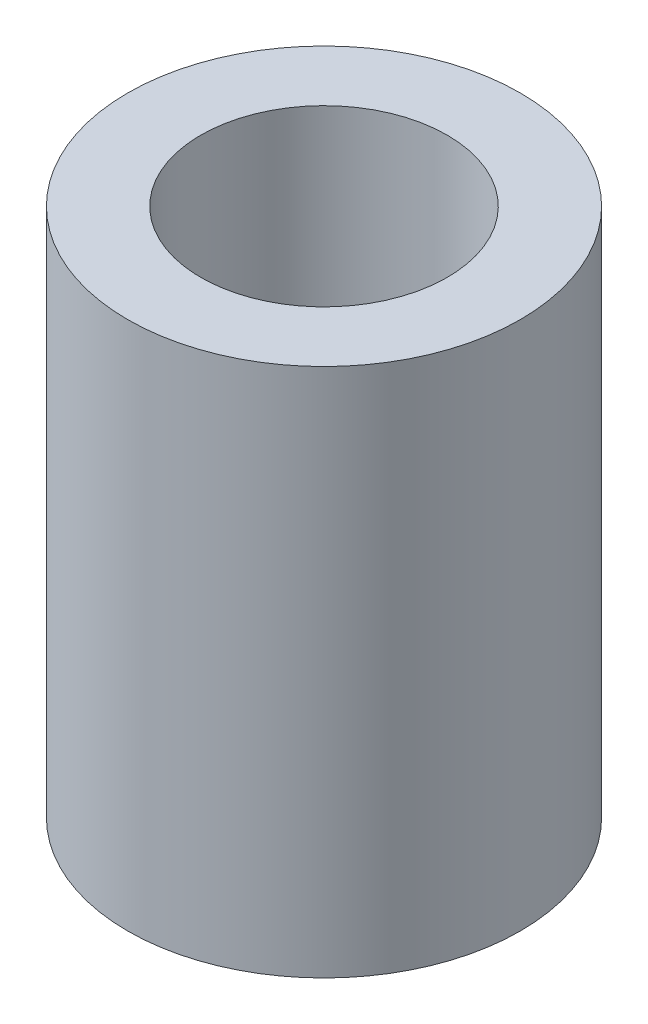
ISO-10303-21;
HEADER;
FILE_DESCRIPTION(('STEP AP214'),'2;1');
FILE_NAME('part.step','',(''),(''),'','','');
FILE_SCHEMA(('AUTOMOTIVE_DESIGN { 1 0 10303 214 1 1 1 1 }'));
ENDSEC;
DATA;
#1=APPLICATION_CONTEXT('core data for automotive mechanical design processes');
#2=APPLICATION_PROTOCOL_DEFINITION('international standard','automotive_design',2000,#1);
#3=PRODUCT_CONTEXT('',#1,'mechanical');
#4=PRODUCT('Part','Part','',(#3));
#5=PRODUCT_RELATED_PRODUCT_CATEGORY('part','',(#4));
#6=PRODUCT_DEFINITION_FORMATION('','',#4);
#7=PRODUCT_DEFINITION_CONTEXT('part definition',#1,'design');
#8=PRODUCT_DEFINITION('design','',#6,#7);
#9=PRODUCT_DEFINITION_SHAPE('','',#8);
#10=(LENGTH_UNIT() NAMED_UNIT(*) SI_UNIT(.MILLI.,.METRE.));
#11=(NAMED_UNIT(*) PLANE_ANGLE_UNIT() SI_UNIT($,.RADIAN.));
#12=(NAMED_UNIT(*) SI_UNIT($,.STERADIAN.) SOLID_ANGLE_UNIT());
#13=UNCERTAINTY_MEASURE_WITH_UNIT(LENGTH_MEASURE(1.E-05),#10,'distance_accuracy_value','');
#14=(GEOMETRIC_REPRESENTATION_CONTEXT(3) GLOBAL_UNCERTAINTY_ASSIGNED_CONTEXT((#13)) GLOBAL_UNIT_ASSIGNED_CONTEXT((#10,
#11,#12)) REPRESENTATION_CONTEXT('',''));
#15=CARTESIAN_POINT('',(0.,0.,0.));
#16=DIRECTION('',(0.,0.,1.));
#17=DIRECTION('',(1.,0.,0.));
#18=AXIS2_PLACEMENT_3D('',#15,#16,#17);
#19=CARTESIAN_POINT('',(0.,14.5,0.));
#20=DIRECTION('',(0.,1.,0.));
#21=DIRECTION('',(0.,0.,1.));
#22=AXIS2_PLACEMENT_3D('',#19,#20,#21);
#23=PLANE('',#22);
#24=CARTESIAN_POINT('',(0.,14.5,0.));
#25=DIRECTION('',(0.,1.,0.));
#26=DIRECTION('',(0.,0.,1.));
#27=AXIS2_PLACEMENT_3D('',#24,#25,#26);
#28=CIRCLE('',#27,5.375);
#29=CARTESIAN_POINT('',(0.,14.5,-5.375));
#30=VERTEX_POINT('',#29);
#31=EDGE_CURVE('E10',#30,#30,#28,.T.);
#32=ORIENTED_EDGE('',*,*,#31,.T.);
#33=EDGE_LOOP('',(#32));
#34=FACE_BOUND('',#33,.T.);
#35=CARTESIAN_POINT('',(0.,14.5,0.));
#36=DIRECTION('',(0.,1.,0.));
#37=DIRECTION('',(0.,0.,1.));
#38=AXIS2_PLACEMENT_3D('',#35,#36,#37);
#39=CIRCLE('',#38,3.375);
#40=CARTESIAN_POINT('',(0.,14.5,-3.375));
#41=VERTEX_POINT('',#40);
#42=EDGE_CURVE('E42',#41,#41,#39,.T.);
#43=ORIENTED_EDGE('',*,*,#42,.F.);
#44=EDGE_LOOP('',(#43));
#45=FACE_BOUND('',#44,.T.);
#46=ADVANCED_FACE('F31',(#34,#45),#23,.T.);
#47=CARTESIAN_POINT('',(0.,0.,0.));
#48=DIRECTION('',(0.,1.,0.));
#49=DIRECTION('',(0.,0.,1.));
#50=AXIS2_PLACEMENT_3D('',#47,#48,#49);
#51=PLANE('',#50);
#52=CARTESIAN_POINT('',(0.,0.,0.));
#53=DIRECTION('',(0.,1.,0.));
#54=DIRECTION('',(0.,0.,1.));
#55=AXIS2_PLACEMENT_3D('',#52,#53,#54);
#56=CIRCLE('',#55,5.375);
#57=CARTESIAN_POINT('',(0.,0.,-5.375));
#58=VERTEX_POINT('',#57);
#59=EDGE_CURVE('E35',#58,#58,#56,.T.);
#60=ORIENTED_EDGE('',*,*,#59,.F.);
#61=EDGE_LOOP('',(#60));
#62=FACE_BOUND('',#61,.T.);
#63=CARTESIAN_POINT('',(0.,0.,0.));
#64=DIRECTION('',(0.,1.,0.));
#65=DIRECTION('',(0.,0.,1.));
#66=AXIS2_PLACEMENT_3D('',#63,#64,#65);
#67=CIRCLE('',#66,3.375);
#68=CARTESIAN_POINT('',(0.,0.,-3.375));
#69=VERTEX_POINT('',#68);
#70=EDGE_CURVE('E44',#69,#69,#67,.T.);
#71=ORIENTED_EDGE('',*,*,#70,.T.);
#72=EDGE_LOOP('',(#71));
#73=FACE_BOUND('',#72,.T.);
#74=ADVANCED_FACE('F54',(#62,#73),#51,.F.);
#75=CARTESIAN_POINT('',(0.,14.5,0.));
#76=DIRECTION('',(0.,-1.,0.));
#77=DIRECTION('',(0.,0.,-1.));
#78=AXIS2_PLACEMENT_3D('',#75,#76,#77);
#79=CYLINDRICAL_SURFACE('',#78,5.375);
#80=CARTESIAN_POINT('',(0.,14.5,-5.375));
#81=CARTESIAN_POINT('',(0.,14.3489583333333,-5.375));
#82=CARTESIAN_POINT('',(0.,14.1979166666667,-5.375));
#83=CARTESIAN_POINT('',(0.,13.8958333333333,-5.375));
#84=CARTESIAN_POINT('',(0.,13.7447916666667,-5.375));
#85=CARTESIAN_POINT('',(0.,13.4427083333333,-5.375));
#86=CARTESIAN_POINT('',(0.,13.2916666666667,-5.375));
#87=CARTESIAN_POINT('',(0.,12.9895833333333,-5.375));
#88=CARTESIAN_POINT('',(0.,12.8385416666667,-5.375));
#89=CARTESIAN_POINT('',(0.,12.5364583333333,-5.375));
#90=CARTESIAN_POINT('',(0.,12.3854166666667,-5.375));
#91=CARTESIAN_POINT('',(0.,12.0833333333333,-5.375));
#92=CARTESIAN_POINT('',(0.,11.9322916666667,-5.375));
#93=CARTESIAN_POINT('',(0.,11.6302083333333,-5.375));
#94=CARTESIAN_POINT('',(0.,11.4791666666667,-5.375));
#95=CARTESIAN_POINT('',(0.,11.1770833333333,-5.375));
#96=CARTESIAN_POINT('',(0.,11.0260416666667,-5.375));
#97=CARTESIAN_POINT('',(0.,10.7239583333333,-5.375));
#98=CARTESIAN_POINT('',(0.,10.5729166666667,-5.375));
#99=CARTESIAN_POINT('',(0.,10.2708333333333,-5.375));
#100=CARTESIAN_POINT('',(0.,10.1197916666667,-5.375));
#101=CARTESIAN_POINT('',(0.,9.81770833333333,-5.375));
#102=CARTESIAN_POINT('',(0.,9.66666666666667,-5.375));
#103=CARTESIAN_POINT('',(0.,9.36458333333333,-5.375));
#104=CARTESIAN_POINT('',(0.,9.21354166666667,-5.375));
#105=CARTESIAN_POINT('',(0.,8.91145833333333,-5.375));
#106=CARTESIAN_POINT('',(0.,8.76041666666667,-5.375));
#107=CARTESIAN_POINT('',(0.,8.45833333333333,-5.375));
#108=CARTESIAN_POINT('',(0.,8.30729166666667,-5.375));
#109=CARTESIAN_POINT('',(0.,8.00520833333333,-5.375));
#110=CARTESIAN_POINT('',(0.,7.85416666666667,-5.375));
#111=CARTESIAN_POINT('',(0.,7.55208333333333,-5.375));
#112=CARTESIAN_POINT('',(0.,7.40104166666667,-5.375));
#113=CARTESIAN_POINT('',(0.,7.09895833333333,-5.375));
#114=CARTESIAN_POINT('',(0.,6.94791666666667,-5.375));
#115=CARTESIAN_POINT('',(0.,6.64583333333333,-5.375));
#116=CARTESIAN_POINT('',(0.,6.49479166666667,-5.375));
#117=CARTESIAN_POINT('',(0.,6.19270833333333,-5.375));
#118=CARTESIAN_POINT('',(0.,6.04166666666667,-5.375));
#119=CARTESIAN_POINT('',(0.,5.73958333333333,-5.375));
#120=CARTESIAN_POINT('',(0.,5.58854166666667,-5.375));
#121=CARTESIAN_POINT('',(0.,5.28645833333333,-5.375));
#122=CARTESIAN_POINT('',(0.,5.13541666666667,-5.375));
#123=CARTESIAN_POINT('',(0.,4.83333333333333,-5.375));
#124=CARTESIAN_POINT('',(0.,4.68229166666667,-5.375));
#125=CARTESIAN_POINT('',(0.,4.38020833333333,-5.375));
#126=CARTESIAN_POINT('',(0.,4.22916666666667,-5.375));
#127=CARTESIAN_POINT('',(0.,3.92708333333333,-5.375));
#128=CARTESIAN_POINT('',(0.,3.77604166666667,-5.375));
#129=CARTESIAN_POINT('',(0.,3.47395833333333,-5.375));
#130=CARTESIAN_POINT('',(0.,3.32291666666667,-5.375));
#131=CARTESIAN_POINT('',(0.,3.02083333333333,-5.375));
#132=CARTESIAN_POINT('',(0.,2.86979166666667,-5.375));
#133=CARTESIAN_POINT('',(0.,2.56770833333333,-5.375));
#134=CARTESIAN_POINT('',(0.,2.41666666666667,-5.375));
#135=CARTESIAN_POINT('',(0.,2.11458333333333,-5.375));
#136=CARTESIAN_POINT('',(0.,1.96354166666667,-5.375));
#137=CARTESIAN_POINT('',(0.,1.66145833333333,-5.375));
#138=CARTESIAN_POINT('',(0.,1.51041666666667,-5.375));
#139=CARTESIAN_POINT('',(0.,1.20833333333333,-5.375));
#140=CARTESIAN_POINT('',(0.,1.05729166666667,-5.375));
#141=CARTESIAN_POINT('',(0.,0.755208333333334,-5.375));
#142=CARTESIAN_POINT('',(0.,0.604166666666667,-5.375));
#143=CARTESIAN_POINT('',(0.,0.302083333333333,-5.375));
#144=CARTESIAN_POINT('',(0.,0.151041666666667,-5.375));
#145=CARTESIAN_POINT('',(0.,0.,-5.375));
#146=B_SPLINE_CURVE_WITH_KNOTS('',3,(#80,#81,#82,#83,#84,#85,#86,#87,#88,#89,#90,#91,#92,#93,
#94,#95,#96,#97,#98,#99,#100,#101,#102,#103,#104,#105,#106,#107,#108,#109,#110,#111,#112,#113,
#114,#115,#116,#117,#118,#119,#120,#121,#122,#123,#124,#125,#126,#127,#128,#129,#130,#131,#132,
#133,#134,#135,#136,#137,#138,#139,#140,#141,#142,#143,#144,#145),.UNSPECIFIED.,.F.,.F.,(4,2,2,
2,2,2,2,2,2,2,2,2,2,2,2,2,2,2,2,2,2,2,2,2,2,2,2,2,2,2,2,2,4),(0.,0.453124999999999,
0.906249999999999,1.359375,1.8125,2.265625,2.71875,3.171875,3.625,4.078125,4.53125,4.984375,
5.4375,5.890625,6.34375,6.796875,7.25,7.703125,8.15625,8.609375,9.0625,9.515625,9.96875,
10.421875,10.875,11.328125,11.78125,12.234375,12.6875,13.140625,13.59375,14.046875,14.5),.UNSPECIFIED.);
#147=EDGE_CURVE('BSEAM33',#30,#58,#146,.T.);
#148=ORIENTED_EDGE('',*,*,#31,.F.);
#149=ORIENTED_EDGE('',*,*,#59,.T.);
#150=ORIENTED_EDGE('',*,*,#147,.T.);
#151=ORIENTED_EDGE('',*,*,#147,.F.);
#152=EDGE_LOOP('',(#148,#150,#149,#151));
#153=FACE_BOUND('',#152,.T.);
#154=ADVANCED_FACE('F33',(#153),#79,.T.);
#155=CARTESIAN_POINT('',(0.,14.5,0.));
#156=DIRECTION('',(0.,-1.,0.));
#157=DIRECTION('',(0.,0.,-1.));
#158=AXIS2_PLACEMENT_3D('',#155,#156,#157);
#159=CYLINDRICAL_SURFACE('',#158,3.375);
#160=CARTESIAN_POINT('',(0.,14.5,-3.375));
#161=CARTESIAN_POINT('',(0.,14.3489583333333,-3.375));
#162=CARTESIAN_POINT('',(0.,14.1979166666667,-3.375));
#163=CARTESIAN_POINT('',(0.,13.8958333333333,-3.375));
#164=CARTESIAN_POINT('',(0.,13.7447916666667,-3.375));
#165=CARTESIAN_POINT('',(0.,13.4427083333333,-3.375));
#166=CARTESIAN_POINT('',(0.,13.2916666666667,-3.375));
#167=CARTESIAN_POINT('',(0.,12.9895833333333,-3.375));
#168=CARTESIAN_POINT('',(0.,12.8385416666667,-3.375));
#169=CARTESIAN_POINT('',(0.,12.5364583333333,-3.375));
#170=CARTESIAN_POINT('',(0.,12.3854166666667,-3.375));
#171=CARTESIAN_POINT('',(0.,12.0833333333333,-3.375));
#172=CARTESIAN_POINT('',(0.,11.9322916666667,-3.375));
#173=CARTESIAN_POINT('',(0.,11.6302083333333,-3.375));
#174=CARTESIAN_POINT('',(0.,11.4791666666667,-3.375));
#175=CARTESIAN_POINT('',(0.,11.1770833333333,-3.375));
#176=CARTESIAN_POINT('',(0.,11.0260416666667,-3.375));
#177=CARTESIAN_POINT('',(0.,10.7239583333333,-3.375));
#178=CARTESIAN_POINT('',(0.,10.5729166666667,-3.375));
#179=CARTESIAN_POINT('',(0.,10.2708333333333,-3.375));
#180=CARTESIAN_POINT('',(0.,10.1197916666667,-3.375));
#181=CARTESIAN_POINT('',(0.,9.81770833333333,-3.375));
#182=CARTESIAN_POINT('',(0.,9.66666666666667,-3.375));
#183=CARTESIAN_POINT('',(0.,9.36458333333333,-3.375));
#184=CARTESIAN_POINT('',(0.,9.21354166666667,-3.375));
#185=CARTESIAN_POINT('',(0.,8.91145833333333,-3.375));
#186=CARTESIAN_POINT('',(0.,8.76041666666667,-3.375));
#187=CARTESIAN_POINT('',(0.,8.45833333333333,-3.375));
#188=CARTESIAN_POINT('',(0.,8.30729166666667,-3.375));
#189=CARTESIAN_POINT('',(0.,8.00520833333333,-3.375));
#190=CARTESIAN_POINT('',(0.,7.85416666666667,-3.375));
#191=CARTESIAN_POINT('',(0.,7.55208333333333,-3.375));
#192=CARTESIAN_POINT('',(0.,7.40104166666667,-3.375));
#193=CARTESIAN_POINT('',(0.,7.09895833333333,-3.375));
#194=CARTESIAN_POINT('',(0.,6.94791666666667,-3.375));
#195=CARTESIAN_POINT('',(0.,6.64583333333333,-3.375));
#196=CARTESIAN_POINT('',(0.,6.49479166666667,-3.375));
#197=CARTESIAN_POINT('',(0.,6.19270833333333,-3.375));
#198=CARTESIAN_POINT('',(0.,6.04166666666667,-3.375));
#199=CARTESIAN_POINT('',(0.,5.73958333333333,-3.375));
#200=CARTESIAN_POINT('',(0.,5.58854166666667,-3.375));
#201=CARTESIAN_POINT('',(0.,5.28645833333333,-3.375));
#202=CARTESIAN_POINT('',(0.,5.13541666666667,-3.375));
#203=CARTESIAN_POINT('',(0.,4.83333333333333,-3.375));
#204=CARTESIAN_POINT('',(0.,4.68229166666667,-3.375));
#205=CARTESIAN_POINT('',(0.,4.38020833333333,-3.375));
#206=CARTESIAN_POINT('',(0.,4.22916666666667,-3.375));
#207=CARTESIAN_POINT('',(0.,3.92708333333333,-3.375));
#208=CARTESIAN_POINT('',(0.,3.77604166666667,-3.375));
#209=CARTESIAN_POINT('',(0.,3.47395833333333,-3.375));
#210=CARTESIAN_POINT('',(0.,3.32291666666667,-3.375));
#211=CARTESIAN_POINT('',(0.,3.02083333333333,-3.375));
#212=CARTESIAN_POINT('',(0.,2.86979166666667,-3.375));
#213=CARTESIAN_POINT('',(0.,2.56770833333333,-3.375));
#214=CARTESIAN_POINT('',(0.,2.41666666666667,-3.375));
#215=CARTESIAN_POINT('',(0.,2.11458333333333,-3.375));
#216=CARTESIAN_POINT('',(0.,1.96354166666667,-3.375));
#217=CARTESIAN_POINT('',(0.,1.66145833333333,-3.375));
#218=CARTESIAN_POINT('',(0.,1.51041666666667,-3.375));
#219=CARTESIAN_POINT('',(0.,1.20833333333333,-3.375));
#220=CARTESIAN_POINT('',(0.,1.05729166666667,-3.375));
#221=CARTESIAN_POINT('',(0.,0.755208333333334,-3.375));
#222=CARTESIAN_POINT('',(0.,0.604166666666667,-3.375));
#223=CARTESIAN_POINT('',(0.,0.302083333333333,-3.375));
#224=CARTESIAN_POINT('',(0.,0.151041666666667,-3.375));
#225=CARTESIAN_POINT('',(0.,0.,-3.375));
#226=B_SPLINE_CURVE_WITH_KNOTS('',3,(#160,#161,#162,#163,#164,#165,#166,#167,#168,#169,#170,
#171,#172,#173,#174,#175,#176,#177,#178,#179,#180,#181,#182,#183,#184,#185,#186,#187,#188,#189,
#190,#191,#192,#193,#194,#195,#196,#197,#198,#199,#200,#201,#202,#203,#204,#205,#206,#207,#208,
#209,#210,#211,#212,#213,#214,#215,#216,#217,#218,#219,#220,#221,#222,#223,#224,#225),
.UNSPECIFIED.,.F.,.F.,(4,2,2,2,2,2,2,2,2,2,2,2,2,2,2,2,2,2,2,2,2,2,2,2,2,2,2,2,2,2,2,2,4),(0.,
0.453125,0.906250000000001,1.359375,1.8125,2.265625,2.71875,3.171875,3.625,4.078125,4.53125,
4.984375,5.4375,5.890625,6.34375,6.796875,7.25,7.703125,8.15625,8.609375,9.0625,9.515625,
9.96875,10.421875,10.875,11.328125,11.78125,12.234375,12.6875,13.140625,13.59375,14.046875,
14.5),.UNSPECIFIED.);
#227=EDGE_CURVE('BSEAM50',#41,#69,#226,.T.);
#228=ORIENTED_EDGE('',*,*,#42,.T.);
#229=ORIENTED_EDGE('',*,*,#70,.F.);
#230=ORIENTED_EDGE('',*,*,#227,.T.);
#231=ORIENTED_EDGE('',*,*,#227,.F.);
#232=EDGE_LOOP('',(#228,#230,#229,#231));
#233=FACE_BOUND('',#232,.T.);
#234=ADVANCED_FACE('F50',(#233),#159,.F.);
#235=CLOSED_SHELL('',(#46,#74,#154,#234));
#236=MANIFOLD_SOLID_BREP('B2',#235);
#237=ADVANCED_BREP_SHAPE_REPRESENTATION('',(#18,#236),#14);
#238=SHAPE_DEFINITION_REPRESENTATION(#9,#237);
ENDSEC;
END-ISO-10303-21;
